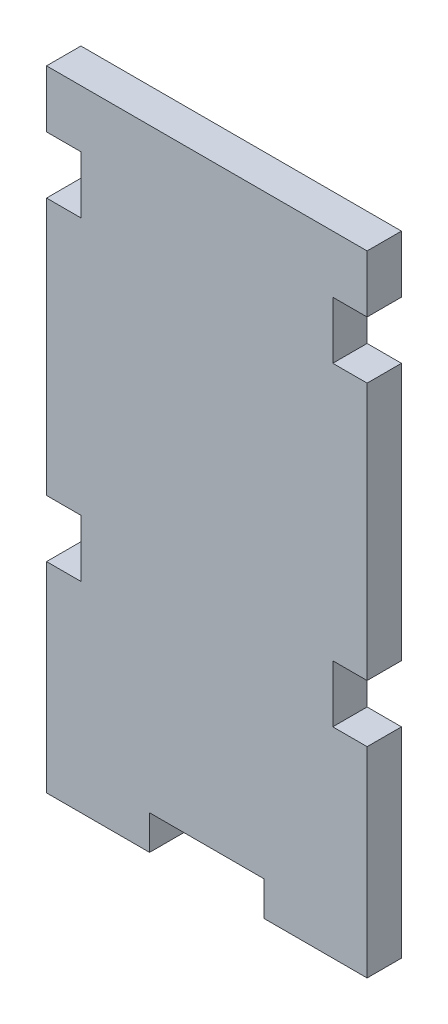
ISO-10303-21;
HEADER;
FILE_DESCRIPTION(('STEP AP214'),'2;1');
FILE_NAME('part.step','',(''),(''),'','','');
FILE_SCHEMA(('AUTOMOTIVE_DESIGN { 1 0 10303 214 1 1 1 1 }'));
ENDSEC;
DATA;
#1=APPLICATION_CONTEXT('core data for automotive mechanical design processes');
#2=APPLICATION_PROTOCOL_DEFINITION('international standard','automotive_design',2000,#1);
#3=PRODUCT_CONTEXT('',#1,'mechanical');
#4=PRODUCT('Part','Part','',(#3));
#5=PRODUCT_RELATED_PRODUCT_CATEGORY('part','',(#4));
#6=PRODUCT_DEFINITION_FORMATION('','',#4);
#7=PRODUCT_DEFINITION_CONTEXT('part definition',#1,'design');
#8=PRODUCT_DEFINITION('design','',#6,#7);
#9=PRODUCT_DEFINITION_SHAPE('','',#8);
#10=(LENGTH_UNIT() NAMED_UNIT(*) SI_UNIT(.MILLI.,.METRE.));
#11=(NAMED_UNIT(*) PLANE_ANGLE_UNIT() SI_UNIT($,.RADIAN.));
#12=(NAMED_UNIT(*) SI_UNIT($,.STERADIAN.) SOLID_ANGLE_UNIT());
#13=UNCERTAINTY_MEASURE_WITH_UNIT(LENGTH_MEASURE(1.E-05),#10,'distance_accuracy_value','');
#14=(GEOMETRIC_REPRESENTATION_CONTEXT(3) GLOBAL_UNCERTAINTY_ASSIGNED_CONTEXT((#13)) GLOBAL_UNIT_ASSIGNED_CONTEXT((#10,
#11,#12)) REPRESENTATION_CONTEXT('',''));
#15=CARTESIAN_POINT('',(0.,0.,0.));
#16=DIRECTION('',(0.,0.,1.));
#17=DIRECTION('',(1.,0.,0.));
#18=AXIS2_PLACEMENT_3D('',#15,#16,#17);
#19=CARTESIAN_POINT('',(0.,0.,6.));
#20=DIRECTION('',(0.,1.,0.));
#21=DIRECTION('',(0.,0.,1.));
#22=AXIS2_PLACEMENT_3D('',#19,#20,#21);
#23=PLANE('',#22);
#24=DIRECTION('',(1.,0.,0.));
#25=VECTOR('',#24,1.);
#26=CARTESIAN_POINT('',(0.,0.,6.));
#27=LINE('',#26,#25);
#28=CARTESIAN_POINT('',(32.,0.,6.));
#29=VERTEX_POINT('',#28);
#30=CARTESIAN_POINT('',(50.,0.,6.));
#31=VERTEX_POINT('',#30);
#32=EDGE_CURVE('E212',#29,#31,#27,.T.);
#33=ORIENTED_EDGE('',*,*,#32,.F.);
#34=DIRECTION('',(0.,0.,-1.));
#35=VECTOR('',#34,1.);
#36=CARTESIAN_POINT('',(32.,0.,6.));
#37=LINE('',#36,#35);
#38=CARTESIAN_POINT('',(32.,0.,0.));
#39=VERTEX_POINT('',#38);
#40=EDGE_CURVE('E197',#29,#39,#37,.T.);
#41=ORIENTED_EDGE('',*,*,#40,.T.);
#42=DIRECTION('',(1.,0.,0.));
#43=VECTOR('',#42,1.);
#44=CARTESIAN_POINT('',(0.,0.,0.));
#45=LINE('',#44,#43);
#46=CARTESIAN_POINT('',(50.,0.,0.));
#47=VERTEX_POINT('',#46);
#48=EDGE_CURVE('E335',#39,#47,#45,.T.);
#49=ORIENTED_EDGE('',*,*,#48,.T.);
#50=DIRECTION('',(0.,0.,1.));
#51=VECTOR('',#50,1.);
#52=CARTESIAN_POINT('',(50.,0.,0.));
#53=LINE('',#52,#51);
#54=EDGE_CURVE('E220',#47,#31,#53,.T.);
#55=ORIENTED_EDGE('',*,*,#54,.T.);
#56=EDGE_LOOP('',(#33,#41,#49,#55));
#57=FACE_BOUND('',#56,.T.);
#58=ADVANCED_FACE('F33',(#57),#23,.F.);
#59=CARTESIAN_POINT('',(44.,0.,6.));
#60=DIRECTION('',(-1.,0.,0.));
#61=DIRECTION('',(0.,-1.,0.));
#62=AXIS2_PLACEMENT_3D('',#59,#60,#61);
#63=PLANE('',#62);
#64=DIRECTION('',(0.,1.,0.));
#65=VECTOR('',#64,1.);
#66=CARTESIAN_POINT('',(44.,0.,0.));
#67=LINE('',#66,#65);
#68=CARTESIAN_POINT('',(44.,90.,0.));
#69=VERTEX_POINT('',#68);
#70=CARTESIAN_POINT('',(44.,100.,0.));
#71=VERTEX_POINT('',#70);
#72=EDGE_CURVE('E339',#69,#71,#67,.T.);
#73=ORIENTED_EDGE('',*,*,#72,.T.);
#74=DIRECTION('',(0.,0.,1.));
#75=VECTOR('',#74,1.);
#76=CARTESIAN_POINT('',(44.,100.,0.));
#77=LINE('',#76,#75);
#78=CARTESIAN_POINT('',(44.,100.,6.));
#79=VERTEX_POINT('',#78);
#80=EDGE_CURVE('E59',#71,#79,#77,.T.);
#81=ORIENTED_EDGE('',*,*,#80,.T.);
#82=DIRECTION('',(0.,1.,0.));
#83=VECTOR('',#82,1.);
#84=CARTESIAN_POINT('',(44.,0.,6.));
#85=LINE('',#84,#83);
#86=CARTESIAN_POINT('',(44.,90.,6.));
#87=VERTEX_POINT('',#86);
#88=EDGE_CURVE('E37',#87,#79,#85,.T.);
#89=ORIENTED_EDGE('',*,*,#88,.F.);
#90=DIRECTION('',(0.,0.,1.));
#91=VECTOR('',#90,1.);
#92=CARTESIAN_POINT('',(44.,90.,0.));
#93=LINE('',#92,#91);
#94=EDGE_CURVE('E360',#69,#87,#93,.T.);
#95=ORIENTED_EDGE('',*,*,#94,.F.);
#96=EDGE_LOOP('',(#73,#81,#89,#95));
#97=FACE_BOUND('',#96,.T.);
#98=ADVANCED_FACE('F445',(#97),#63,.F.);
#99=CARTESIAN_POINT('',(44.,35.,0.));
#100=VERTEX_POINT('',#99);
#101=CARTESIAN_POINT('',(44.,45.,0.));
#102=VERTEX_POINT('',#101);
#103=EDGE_CURVE('E239',#100,#102,#67,.T.);
#104=ORIENTED_EDGE('',*,*,#103,.T.);
#105=DIRECTION('',(0.,0.,1.));
#106=VECTOR('',#105,1.);
#107=CARTESIAN_POINT('',(44.,45.,0.));
#108=LINE('',#107,#106);
#109=CARTESIAN_POINT('',(44.,45.,6.));
#110=VERTEX_POINT('',#109);
#111=EDGE_CURVE('E353',#102,#110,#108,.T.);
#112=ORIENTED_EDGE('',*,*,#111,.T.);
#113=CARTESIAN_POINT('',(44.,35.,6.));
#114=VERTEX_POINT('',#113);
#115=EDGE_CURVE('E43',#114,#110,#85,.T.);
#116=ORIENTED_EDGE('',*,*,#115,.F.);
#117=DIRECTION('',(0.,0.,1.));
#118=VECTOR('',#117,1.);
#119=CARTESIAN_POINT('',(44.,35.,0.));
#120=LINE('',#119,#118);
#121=EDGE_CURVE('E242',#100,#114,#120,.T.);
#122=ORIENTED_EDGE('',*,*,#121,.F.);
#123=EDGE_LOOP('',(#104,#112,#116,#122));
#124=FACE_BOUND('',#123,.T.);
#125=ADVANCED_FACE('F423',(#124),#63,.F.);
#126=CARTESIAN_POINT('',(0.,0.,6.));
#127=DIRECTION('',(1.,0.,0.));
#128=DIRECTION('',(0.,1.,0.));
#129=AXIS2_PLACEMENT_3D('',#126,#127,#128);
#130=PLANE('',#129);
#131=DIRECTION('',(0.,-1.,0.));
#132=VECTOR('',#131,1.);
#133=CARTESIAN_POINT('',(0.,0.,0.));
#134=LINE('',#133,#132);
#135=CARTESIAN_POINT('',(0.,45.,0.));
#136=VERTEX_POINT('',#135);
#137=CARTESIAN_POINT('',(0.,35.,0.));
#138=VERTEX_POINT('',#137);
#139=EDGE_CURVE('E318',#136,#138,#134,.T.);
#140=ORIENTED_EDGE('',*,*,#139,.T.);
#141=DIRECTION('',(0.,0.,1.));
#142=VECTOR('',#141,1.);
#143=CARTESIAN_POINT('',(0.,35.,0.));
#144=LINE('',#143,#142);
#145=CARTESIAN_POINT('',(0.,35.,6.));
#146=VERTEX_POINT('',#145);
#147=EDGE_CURVE('E265',#138,#146,#144,.T.);
#148=ORIENTED_EDGE('',*,*,#147,.T.);
#149=DIRECTION('',(0.,-1.,0.));
#150=VECTOR('',#149,1.);
#151=CARTESIAN_POINT('',(0.,0.,6.));
#152=LINE('',#151,#150);
#153=CARTESIAN_POINT('',(0.,45.,6.));
#154=VERTEX_POINT('',#153);
#155=EDGE_CURVE('E227',#154,#146,#152,.T.);
#156=ORIENTED_EDGE('',*,*,#155,.F.);
#157=DIRECTION('',(0.,0.,1.));
#158=VECTOR('',#157,1.);
#159=CARTESIAN_POINT('',(0.,45.,0.));
#160=LINE('',#159,#158);
#161=EDGE_CURVE('E295',#136,#154,#160,.T.);
#162=ORIENTED_EDGE('',*,*,#161,.F.);
#163=EDGE_LOOP('',(#140,#148,#156,#162));
#164=FACE_BOUND('',#163,.T.);
#165=ADVANCED_FACE('F458',(#164),#130,.F.);
#166=CARTESIAN_POINT('',(0.,100.,0.));
#167=VERTEX_POINT('',#166);
#168=CARTESIAN_POINT('',(0.,90.,0.));
#169=VERTEX_POINT('',#168);
#170=EDGE_CURVE('E329',#167,#169,#134,.T.);
#171=ORIENTED_EDGE('',*,*,#170,.T.);
#172=DIRECTION('',(0.,0.,1.));
#173=VECTOR('',#172,1.);
#174=CARTESIAN_POINT('',(0.,90.,0.));
#175=LINE('',#174,#173);
#176=CARTESIAN_POINT('',(0.,90.,6.));
#177=VERTEX_POINT('',#176);
#178=EDGE_CURVE('E287',#169,#177,#175,.T.);
#179=ORIENTED_EDGE('',*,*,#178,.T.);
#180=CARTESIAN_POINT('',(0.,100.,6.));
#181=VERTEX_POINT('',#180);
#182=EDGE_CURVE('E223',#181,#177,#152,.T.);
#183=ORIENTED_EDGE('',*,*,#182,.F.);
#184=DIRECTION('',(0.,0.,1.));
#185=VECTOR('',#184,1.);
#186=CARTESIAN_POINT('',(0.,100.,0.));
#187=LINE('',#186,#185);
#188=EDGE_CURVE('E315',#167,#181,#187,.T.);
#189=ORIENTED_EDGE('',*,*,#188,.F.);
#190=EDGE_LOOP('',(#171,#179,#183,#189));
#191=FACE_BOUND('',#190,.T.);
#192=ADVANCED_FACE('F35',(#191),#130,.F.);
#193=CARTESIAN_POINT('',(-6.,0.,0.));
#194=VERTEX_POINT('',#193);
#195=CARTESIAN_POINT('',(12.,0.,0.));
#196=VERTEX_POINT('',#195);
#197=EDGE_CURVE('E332',#194,#196,#45,.T.);
#198=ORIENTED_EDGE('',*,*,#197,.T.);
#199=DIRECTION('',(0.,0.,-1.));
#200=VECTOR('',#199,1.);
#201=CARTESIAN_POINT('',(12.,0.,6.));
#202=LINE('',#201,#200);
#203=CARTESIAN_POINT('',(12.,0.,6.));
#204=VERTEX_POINT('',#203);
#205=EDGE_CURVE('E51',#204,#196,#202,.T.);
#206=ORIENTED_EDGE('',*,*,#205,.F.);
#207=CARTESIAN_POINT('',(-6.,0.,6.));
#208=VERTEX_POINT('',#207);
#209=EDGE_CURVE('E222',#208,#204,#27,.T.);
#210=ORIENTED_EDGE('',*,*,#209,.F.);
#211=DIRECTION('',(0.,0.,1.));
#212=VECTOR('',#211,1.);
#213=CARTESIAN_POINT('',(-6.,0.,0.));
#214=LINE('',#213,#212);
#215=EDGE_CURVE('E270',#194,#208,#214,.T.);
#216=ORIENTED_EDGE('',*,*,#215,.F.);
#217=EDGE_LOOP('',(#198,#206,#210,#216));
#218=FACE_BOUND('',#217,.T.);
#219=ADVANCED_FACE('F412',(#218),#23,.F.);
#220=CARTESIAN_POINT('',(0.,110.,6.));
#221=DIRECTION('',(0.,-1.,0.));
#222=DIRECTION('',(0.,0.,-1.));
#223=AXIS2_PLACEMENT_3D('',#220,#221,#222);
#224=PLANE('',#223);
#225=DIRECTION('',(-1.,0.,0.));
#226=VECTOR('',#225,1.);
#227=CARTESIAN_POINT('',(0.,110.,0.));
#228=LINE('',#227,#226);
#229=CARTESIAN_POINT('',(50.,110.,0.));
#230=VERTEX_POINT('',#229);
#231=CARTESIAN_POINT('',(-6.00000000000003,110.,0.));
#232=VERTEX_POINT('',#231);
#233=EDGE_CURVE('E336',#230,#232,#228,.T.);
#234=ORIENTED_EDGE('',*,*,#233,.T.);
#235=DIRECTION('',(0.,0.,1.));
#236=VECTOR('',#235,1.);
#237=CARTESIAN_POINT('',(-6.00000000000003,110.,0.));
#238=LINE('',#237,#236);
#239=CARTESIAN_POINT('',(-6.00000000000003,110.,6.));
#240=VERTEX_POINT('',#239);
#241=EDGE_CURVE('E326',#232,#240,#238,.T.);
#242=ORIENTED_EDGE('',*,*,#241,.T.);
#243=DIRECTION('',(-1.,0.,0.));
#244=VECTOR('',#243,1.);
#245=CARTESIAN_POINT('',(0.,110.,6.));
#246=LINE('',#245,#244);
#247=CARTESIAN_POINT('',(50.,110.,6.));
#248=VERTEX_POINT('',#247);
#249=EDGE_CURVE('E11',#248,#240,#246,.T.);
#250=ORIENTED_EDGE('',*,*,#249,.F.);
#251=DIRECTION('',(0.,0.,1.));
#252=VECTOR('',#251,1.);
#253=CARTESIAN_POINT('',(50.,110.,0.));
#254=LINE('',#253,#252);
#255=EDGE_CURVE('E373',#230,#248,#254,.T.);
#256=ORIENTED_EDGE('',*,*,#255,.F.);
#257=EDGE_LOOP('',(#234,#242,#250,#256));
#258=FACE_BOUND('',#257,.T.);
#259=ADVANCED_FACE('F451',(#258),#224,.F.);
#260=CARTESIAN_POINT('',(0.,0.,6.));
#261=DIRECTION('',(0.,0.,-1.));
#262=DIRECTION('',(-1.,0.,0.));
#263=AXIS2_PLACEMENT_3D('',#260,#261,#262);
#264=PLANE('',#263);
#265=DIRECTION('',(1.,0.,0.));
#266=VECTOR('',#265,1.);
#267=CARTESIAN_POINT('',(32.,6.,6.));
#268=LINE('',#267,#266);
#269=CARTESIAN_POINT('',(12.,6.,6.));
#270=VERTEX_POINT('',#269);
#271=CARTESIAN_POINT('',(32.,6.,6.));
#272=VERTEX_POINT('',#271);
#273=EDGE_CURVE('E207',#270,#272,#268,.T.);
#274=ORIENTED_EDGE('',*,*,#273,.T.);
#275=DIRECTION('',(0.,-1.,0.));
#276=VECTOR('',#275,1.);
#277=CARTESIAN_POINT('',(32.,0.,6.));
#278=LINE('',#277,#276);
#279=EDGE_CURVE('E200',#272,#29,#278,.T.);
#280=ORIENTED_EDGE('',*,*,#279,.T.);
#281=ORIENTED_EDGE('',*,*,#32,.T.);
#282=DIRECTION('',(0.,1.,0.));
#283=VECTOR('',#282,1.);
#284=CARTESIAN_POINT('',(50.,0.,6.));
#285=LINE('',#284,#283);
#286=CARTESIAN_POINT('',(50.,35.,6.));
#287=VERTEX_POINT('',#286);
#288=EDGE_CURVE('E253',#31,#287,#285,.T.);
#289=ORIENTED_EDGE('',*,*,#288,.T.);
#290=DIRECTION('',(-1.,0.,0.));
#291=VECTOR('',#290,1.);
#292=CARTESIAN_POINT('',(44.,35.,6.));
#293=LINE('',#292,#291);
#294=EDGE_CURVE('E248',#287,#114,#293,.T.);
#295=ORIENTED_EDGE('',*,*,#294,.T.);
#296=ORIENTED_EDGE('',*,*,#115,.T.);
#297=DIRECTION('',(1.,0.,0.));
#298=VECTOR('',#297,1.);
#299=CARTESIAN_POINT('',(44.,45.,6.));
#300=LINE('',#299,#298);
#301=CARTESIAN_POINT('',(50.,45.,6.));
#302=VERTEX_POINT('',#301);
#303=EDGE_CURVE('E370',#110,#302,#300,.T.);
#304=ORIENTED_EDGE('',*,*,#303,.T.);
#305=DIRECTION('',(0.,1.,0.));
#306=VECTOR('',#305,1.);
#307=CARTESIAN_POINT('',(50.,45.,6.));
#308=LINE('',#307,#306);
#309=CARTESIAN_POINT('',(50.,90.,6.));
#310=VERTEX_POINT('',#309);
#311=EDGE_CURVE('E367',#302,#310,#308,.T.);
#312=ORIENTED_EDGE('',*,*,#311,.T.);
#313=DIRECTION('',(-1.,0.,0.));
#314=VECTOR('',#313,1.);
#315=CARTESIAN_POINT('',(44.,90.,6.));
#316=LINE('',#315,#314);
#317=EDGE_CURVE('E363',#310,#87,#316,.T.);
#318=ORIENTED_EDGE('',*,*,#317,.T.);
#319=ORIENTED_EDGE('',*,*,#88,.T.);
#320=DIRECTION('',(1.,0.,0.));
#321=VECTOR('',#320,1.);
#322=CARTESIAN_POINT('',(44.,100.,6.));
#323=LINE('',#322,#321);
#324=CARTESIAN_POINT('',(50.,100.,6.));
#325=VERTEX_POINT('',#324);
#326=EDGE_CURVE('E391',#79,#325,#323,.T.);
#327=ORIENTED_EDGE('',*,*,#326,.T.);
#328=DIRECTION('',(0.,1.,0.));
#329=VECTOR('',#328,1.);
#330=CARTESIAN_POINT('',(50.,110.,6.));
#331=LINE('',#330,#329);
#332=EDGE_CURVE('E387',#325,#248,#331,.T.);
#333=ORIENTED_EDGE('',*,*,#332,.T.);
#334=ORIENTED_EDGE('',*,*,#249,.T.);
#335=DIRECTION('',(0.,-1.,0.));
#336=VECTOR('',#335,1.);
#337=CARTESIAN_POINT('',(-6.00000000000003,110.,6.));
#338=LINE('',#337,#336);
#339=CARTESIAN_POINT('',(-6.00000000000003,100.,6.));
#340=VERTEX_POINT('',#339);
#341=EDGE_CURVE('E298',#240,#340,#338,.T.);
#342=ORIENTED_EDGE('',*,*,#341,.T.);
#343=DIRECTION('',(1.,0.,0.));
#344=VECTOR('',#343,1.);
#345=CARTESIAN_POINT('',(0.,100.,6.));
#346=LINE('',#345,#344);
#347=EDGE_CURVE('E308',#340,#181,#346,.T.);
#348=ORIENTED_EDGE('',*,*,#347,.T.);
#349=ORIENTED_EDGE('',*,*,#182,.T.);
#350=DIRECTION('',(-1.,0.,0.));
#351=VECTOR('',#350,1.);
#352=CARTESIAN_POINT('',(0.,90.,6.));
#353=LINE('',#352,#351);
#354=CARTESIAN_POINT('',(-6.00000000000003,90.,6.));
#355=VERTEX_POINT('',#354);
#356=EDGE_CURVE('E273',#177,#355,#353,.T.);
#357=ORIENTED_EDGE('',*,*,#356,.T.);
#358=DIRECTION('',(0.,-1.,0.));
#359=VECTOR('',#358,1.);
#360=CARTESIAN_POINT('',(-6.00000000000003,90.,6.));
#361=LINE('',#360,#359);
#362=CARTESIAN_POINT('',(-6.00000000000002,45.,6.));
#363=VERTEX_POINT('',#362);
#364=EDGE_CURVE('E290',#355,#363,#361,.T.);
#365=ORIENTED_EDGE('',*,*,#364,.T.);
#366=DIRECTION('',(1.,0.,0.));
#367=VECTOR('',#366,1.);
#368=CARTESIAN_POINT('',(0.,45.,6.));
#369=LINE('',#368,#367);
#370=EDGE_CURVE('E281',#363,#154,#369,.T.);
#371=ORIENTED_EDGE('',*,*,#370,.T.);
#372=ORIENTED_EDGE('',*,*,#155,.T.);
#373=DIRECTION('',(-1.,0.,0.));
#374=VECTOR('',#373,1.);
#375=CARTESIAN_POINT('',(0.,35.,6.));
#376=LINE('',#375,#374);
#377=CARTESIAN_POINT('',(-6.,35.,6.));
#378=VERTEX_POINT('',#377);
#379=EDGE_CURVE('E246',#146,#378,#376,.T.);
#380=ORIENTED_EDGE('',*,*,#379,.T.);
#381=DIRECTION('',(0.,-1.,0.));
#382=VECTOR('',#381,1.);
#383=CARTESIAN_POINT('',(-6.,0.,6.));
#384=LINE('',#383,#382);
#385=EDGE_CURVE('E262',#378,#208,#384,.T.);
#386=ORIENTED_EDGE('',*,*,#385,.T.);
#387=ORIENTED_EDGE('',*,*,#209,.T.);
#388=DIRECTION('',(0.,1.,0.));
#389=VECTOR('',#388,1.);
#390=CARTESIAN_POINT('',(12.,0.,6.));
#391=LINE('',#390,#389);
#392=EDGE_CURVE('E216',#204,#270,#391,.T.);
#393=ORIENTED_EDGE('',*,*,#392,.T.);
#394=EDGE_LOOP('',(#274,#280,#281,#289,#295,#296,#304,#312,#318,#319,#327,#333,#334,#342,#348,
#349,#357,#365,#371,#372,#380,#386,#387,#393));
#395=FACE_BOUND('',#394,.T.);
#396=ADVANCED_FACE('F210',(#395),#264,.F.);
#397=CARTESIAN_POINT('',(0.,0.,0.));
#398=DIRECTION('',(0.,0.,-1.));
#399=DIRECTION('',(-1.,0.,0.));
#400=AXIS2_PLACEMENT_3D('',#397,#398,#399);
#401=PLANE('',#400);
#402=DIRECTION('',(0.,-1.,0.));
#403=VECTOR('',#402,1.);
#404=CARTESIAN_POINT('',(32.,0.,0.));
#405=LINE('',#404,#403);
#406=CARTESIAN_POINT('',(32.,6.,0.));
#407=VERTEX_POINT('',#406);
#408=EDGE_CURVE('E203',#407,#39,#405,.T.);
#409=ORIENTED_EDGE('',*,*,#408,.F.);
#410=DIRECTION('',(1.,0.,0.));
#411=VECTOR('',#410,1.);
#412=CARTESIAN_POINT('',(32.,6.,0.));
#413=LINE('',#412,#411);
#414=CARTESIAN_POINT('',(12.,6.,0.));
#415=VERTEX_POINT('',#414);
#416=EDGE_CURVE('E217',#415,#407,#413,.T.);
#417=ORIENTED_EDGE('',*,*,#416,.F.);
#418=DIRECTION('',(0.,1.,0.));
#419=VECTOR('',#418,1.);
#420=CARTESIAN_POINT('',(12.,0.,0.));
#421=LINE('',#420,#419);
#422=EDGE_CURVE('E405',#196,#415,#421,.T.);
#423=ORIENTED_EDGE('',*,*,#422,.F.);
#424=ORIENTED_EDGE('',*,*,#197,.F.);
#425=DIRECTION('',(0.,-1.,0.));
#426=VECTOR('',#425,1.);
#427=CARTESIAN_POINT('',(-6.,0.,0.));
#428=LINE('',#427,#426);
#429=CARTESIAN_POINT('',(-6.,35.,0.));
#430=VERTEX_POINT('',#429);
#431=EDGE_CURVE('E261',#430,#194,#428,.T.);
#432=ORIENTED_EDGE('',*,*,#431,.F.);
#433=DIRECTION('',(-1.,0.,0.));
#434=VECTOR('',#433,1.);
#435=CARTESIAN_POINT('',(0.,35.,0.));
#436=LINE('',#435,#434);
#437=EDGE_CURVE('E258',#138,#430,#436,.T.);
#438=ORIENTED_EDGE('',*,*,#437,.F.);
#439=ORIENTED_EDGE('',*,*,#139,.F.);
#440=DIRECTION('',(1.,0.,0.));
#441=VECTOR('',#440,1.);
#442=CARTESIAN_POINT('',(0.,45.,0.));
#443=LINE('',#442,#441);
#444=CARTESIAN_POINT('',(-6.00000000000002,45.,0.));
#445=VERTEX_POINT('',#444);
#446=EDGE_CURVE('E284',#445,#136,#443,.T.);
#447=ORIENTED_EDGE('',*,*,#446,.F.);
#448=DIRECTION('',(0.,-1.,0.));
#449=VECTOR('',#448,1.);
#450=CARTESIAN_POINT('',(-6.00000000000003,90.,0.));
#451=LINE('',#450,#449);
#452=CARTESIAN_POINT('',(-6.00000000000003,90.,0.));
#453=VERTEX_POINT('',#452);
#454=EDGE_CURVE('E280',#453,#445,#451,.T.);
#455=ORIENTED_EDGE('',*,*,#454,.F.);
#456=DIRECTION('',(-1.,0.,0.));
#457=VECTOR('',#456,1.);
#458=CARTESIAN_POINT('',(0.,90.,0.));
#459=LINE('',#458,#457);
#460=EDGE_CURVE('E277',#169,#453,#459,.T.);
#461=ORIENTED_EDGE('',*,*,#460,.F.);
#462=ORIENTED_EDGE('',*,*,#170,.F.);
#463=DIRECTION('',(1.,0.,0.));
#464=VECTOR('',#463,1.);
#465=CARTESIAN_POINT('',(0.,100.,0.));
#466=LINE('',#465,#464);
#467=CARTESIAN_POINT('',(-6.00000000000003,100.,0.));
#468=VERTEX_POINT('',#467);
#469=EDGE_CURVE('E307',#468,#167,#466,.T.);
#470=ORIENTED_EDGE('',*,*,#469,.F.);
#471=DIRECTION('',(0.,-1.,0.));
#472=VECTOR('',#471,1.);
#473=CARTESIAN_POINT('',(-6.00000000000003,110.,0.));
#474=LINE('',#473,#472);
#475=EDGE_CURVE('E304',#232,#468,#474,.T.);
#476=ORIENTED_EDGE('',*,*,#475,.F.);
#477=ORIENTED_EDGE('',*,*,#233,.F.);
#478=DIRECTION('',(0.,1.,0.));
#479=VECTOR('',#478,1.);
#480=CARTESIAN_POINT('',(50.,110.,0.));
#481=LINE('',#480,#479);
#482=CARTESIAN_POINT('',(50.,100.,0.));
#483=VERTEX_POINT('',#482);
#484=EDGE_CURVE('E383',#483,#230,#481,.T.);
#485=ORIENTED_EDGE('',*,*,#484,.F.);
#486=DIRECTION('',(1.,0.,0.));
#487=VECTOR('',#486,1.);
#488=CARTESIAN_POINT('',(44.,100.,0.));
#489=LINE('',#488,#487);
#490=EDGE_CURVE('E390',#71,#483,#489,.T.);
#491=ORIENTED_EDGE('',*,*,#490,.F.);
#492=ORIENTED_EDGE('',*,*,#72,.F.);
#493=DIRECTION('',(-1.,0.,0.));
#494=VECTOR('',#493,1.);
#495=CARTESIAN_POINT('',(44.,90.,0.));
#496=LINE('',#495,#494);
#497=CARTESIAN_POINT('',(50.,90.,0.));
#498=VERTEX_POINT('',#497);
#499=EDGE_CURVE('E356',#498,#69,#496,.T.);
#500=ORIENTED_EDGE('',*,*,#499,.F.);
#501=DIRECTION('',(0.,1.,0.));
#502=VECTOR('',#501,1.);
#503=CARTESIAN_POINT('',(50.,45.,0.));
#504=LINE('',#503,#502);
#505=CARTESIAN_POINT('',(50.,45.,0.));
#506=VERTEX_POINT('',#505);
#507=EDGE_CURVE('E376',#506,#498,#504,.T.);
#508=ORIENTED_EDGE('',*,*,#507,.F.);
#509=DIRECTION('',(1.,0.,0.));
#510=VECTOR('',#509,1.);
#511=CARTESIAN_POINT('',(44.,45.,0.));
#512=LINE('',#511,#510);
#513=EDGE_CURVE('E366',#102,#506,#512,.T.);
#514=ORIENTED_EDGE('',*,*,#513,.F.);
#515=ORIENTED_EDGE('',*,*,#103,.F.);
#516=DIRECTION('',(-1.,0.,0.));
#517=VECTOR('',#516,1.);
#518=CARTESIAN_POINT('',(44.,35.,0.));
#519=LINE('',#518,#517);
#520=CARTESIAN_POINT('',(50.,35.,0.));
#521=VERTEX_POINT('',#520);
#522=EDGE_CURVE('E257',#521,#100,#519,.T.);
#523=ORIENTED_EDGE('',*,*,#522,.F.);
#524=DIRECTION('',(0.,1.,0.));
#525=VECTOR('',#524,1.);
#526=CARTESIAN_POINT('',(50.,0.,0.));
#527=LINE('',#526,#525);
#528=EDGE_CURVE('E344',#47,#521,#527,.T.);
#529=ORIENTED_EDGE('',*,*,#528,.F.);
#530=ORIENTED_EDGE('',*,*,#48,.F.);
#531=EDGE_LOOP('',(#409,#417,#423,#424,#432,#438,#439,#447,#455,#461,#462,#470,#476,#477,#485,
#491,#492,#500,#508,#514,#515,#523,#529,#530));
#532=FACE_BOUND('',#531,.T.);
#533=ADVANCED_FACE('F417',(#532),#401,.T.);
#534=CARTESIAN_POINT('',(0.,100.,0.));
#535=DIRECTION('',(0.,-1.,0.));
#536=DIRECTION('',(0.,0.,-1.));
#537=AXIS2_PLACEMENT_3D('',#534,#535,#536);
#538=PLANE('',#537);
#539=ORIENTED_EDGE('',*,*,#347,.F.);
#540=DIRECTION('',(0.,0.,1.));
#541=VECTOR('',#540,1.);
#542=CARTESIAN_POINT('',(-6.00000000000003,100.,0.));
#543=LINE('',#542,#541);
#544=EDGE_CURVE('E313',#468,#340,#543,.T.);
#545=ORIENTED_EDGE('',*,*,#544,.F.);
#546=ORIENTED_EDGE('',*,*,#469,.T.);
#547=ORIENTED_EDGE('',*,*,#188,.T.);
#548=EDGE_LOOP('',(#539,#545,#546,#547));
#549=FACE_BOUND('',#548,.T.);
#550=ADVANCED_FACE('F479',(#549),#538,.T.);
#551=CARTESIAN_POINT('',(-6.00000000000003,110.,0.));
#552=DIRECTION('',(-1.,0.,0.));
#553=DIRECTION('',(0.,-1.,0.));
#554=AXIS2_PLACEMENT_3D('',#551,#552,#553);
#555=PLANE('',#554);
#556=ORIENTED_EDGE('',*,*,#341,.F.);
#557=ORIENTED_EDGE('',*,*,#241,.F.);
#558=ORIENTED_EDGE('',*,*,#475,.T.);
#559=ORIENTED_EDGE('',*,*,#544,.T.);
#560=EDGE_LOOP('',(#556,#557,#558,#559));
#561=FACE_BOUND('',#560,.T.);
#562=ADVANCED_FACE('F486',(#561),#555,.T.);
#563=CARTESIAN_POINT('',(0.,45.,0.));
#564=DIRECTION('',(0.,-1.,0.));
#565=DIRECTION('',(0.,0.,-1.));
#566=AXIS2_PLACEMENT_3D('',#563,#564,#565);
#567=PLANE('',#566);
#568=ORIENTED_EDGE('',*,*,#370,.F.);
#569=DIRECTION('',(0.,0.,1.));
#570=VECTOR('',#569,1.);
#571=CARTESIAN_POINT('',(-6.00000000000002,45.,0.));
#572=LINE('',#571,#570);
#573=EDGE_CURVE('E299',#445,#363,#572,.T.);
#574=ORIENTED_EDGE('',*,*,#573,.F.);
#575=ORIENTED_EDGE('',*,*,#446,.T.);
#576=ORIENTED_EDGE('',*,*,#161,.T.);
#577=EDGE_LOOP('',(#568,#574,#575,#576));
#578=FACE_BOUND('',#577,.T.);
#579=ADVANCED_FACE('F586',(#578),#567,.T.);
#580=CARTESIAN_POINT('',(-6.00000000000003,90.,0.));
#581=DIRECTION('',(-1.,0.,0.));
#582=DIRECTION('',(0.,-1.,0.));
#583=AXIS2_PLACEMENT_3D('',#580,#581,#582);
#584=PLANE('',#583);
#585=ORIENTED_EDGE('',*,*,#364,.F.);
#586=DIRECTION('',(0.,0.,1.));
#587=VECTOR('',#586,1.);
#588=CARTESIAN_POINT('',(-6.00000000000003,90.,0.));
#589=LINE('',#588,#587);
#590=EDGE_CURVE('E301',#453,#355,#589,.T.);
#591=ORIENTED_EDGE('',*,*,#590,.F.);
#592=ORIENTED_EDGE('',*,*,#454,.T.);
#593=ORIENTED_EDGE('',*,*,#573,.T.);
#594=EDGE_LOOP('',(#585,#591,#592,#593));
#595=FACE_BOUND('',#594,.T.);
#596=ADVANCED_FACE('F475',(#595),#584,.T.);
#597=CARTESIAN_POINT('',(0.,90.,0.));
#598=DIRECTION('',(0.,1.,0.));
#599=DIRECTION('',(0.,0.,1.));
#600=AXIS2_PLACEMENT_3D('',#597,#598,#599);
#601=PLANE('',#600);
#602=ORIENTED_EDGE('',*,*,#356,.F.);
#603=ORIENTED_EDGE('',*,*,#178,.F.);
#604=ORIENTED_EDGE('',*,*,#460,.T.);
#605=ORIENTED_EDGE('',*,*,#590,.T.);
#606=EDGE_LOOP('',(#602,#603,#604,#605));
#607=FACE_BOUND('',#606,.T.);
#608=ADVANCED_FACE('F470',(#607),#601,.T.);
#609=CARTESIAN_POINT('',(-6.,0.,0.));
#610=DIRECTION('',(-1.,0.,0.));
#611=DIRECTION('',(0.,0.,1.));
#612=AXIS2_PLACEMENT_3D('',#609,#610,#611);
#613=PLANE('',#612);
#614=ORIENTED_EDGE('',*,*,#385,.F.);
#615=DIRECTION('',(0.,0.,1.));
#616=VECTOR('',#615,1.);
#617=CARTESIAN_POINT('',(-6.,35.,0.));
#618=LINE('',#617,#616);
#619=EDGE_CURVE('E274',#430,#378,#618,.T.);
#620=ORIENTED_EDGE('',*,*,#619,.F.);
#621=ORIENTED_EDGE('',*,*,#431,.T.);
#622=ORIENTED_EDGE('',*,*,#215,.T.);
#623=EDGE_LOOP('',(#614,#620,#621,#622));
#624=FACE_BOUND('',#623,.T.);
#625=ADVANCED_FACE('F440',(#624),#613,.T.);
#626=CARTESIAN_POINT('',(0.,35.,0.));
#627=DIRECTION('',(0.,1.,0.));
#628=DIRECTION('',(0.,0.,1.));
#629=AXIS2_PLACEMENT_3D('',#626,#627,#628);
#630=PLANE('',#629);
#631=ORIENTED_EDGE('',*,*,#379,.F.);
#632=ORIENTED_EDGE('',*,*,#147,.F.);
#633=ORIENTED_EDGE('',*,*,#437,.T.);
#634=ORIENTED_EDGE('',*,*,#619,.T.);
#635=EDGE_LOOP('',(#631,#632,#633,#634));
#636=FACE_BOUND('',#635,.T.);
#637=ADVANCED_FACE('F432',(#636),#630,.T.);
#638=CARTESIAN_POINT('',(44.,35.,0.));
#639=DIRECTION('',(0.,1.,0.));
#640=DIRECTION('',(0.,0.,1.));
#641=AXIS2_PLACEMENT_3D('',#638,#639,#640);
#642=PLANE('',#641);
#643=ORIENTED_EDGE('',*,*,#294,.F.);
#644=DIRECTION('',(0.,0.,1.));
#645=VECTOR('',#644,1.);
#646=CARTESIAN_POINT('',(50.,35.,0.));
#647=LINE('',#646,#645);
#648=EDGE_CURVE('E247',#521,#287,#647,.T.);
#649=ORIENTED_EDGE('',*,*,#648,.F.);
#650=ORIENTED_EDGE('',*,*,#522,.T.);
#651=ORIENTED_EDGE('',*,*,#121,.T.);
#652=EDGE_LOOP('',(#643,#649,#650,#651));
#653=FACE_BOUND('',#652,.T.);
#654=ADVANCED_FACE('F430',(#653),#642,.T.);
#655=CARTESIAN_POINT('',(50.,0.,0.));
#656=DIRECTION('',(1.,0.,0.));
#657=DIRECTION('',(0.,0.,-1.));
#658=AXIS2_PLACEMENT_3D('',#655,#656,#657);
#659=PLANE('',#658);
#660=ORIENTED_EDGE('',*,*,#288,.F.);
#661=ORIENTED_EDGE('',*,*,#54,.F.);
#662=ORIENTED_EDGE('',*,*,#528,.T.);
#663=ORIENTED_EDGE('',*,*,#648,.T.);
#664=EDGE_LOOP('',(#660,#661,#662,#663));
#665=FACE_BOUND('',#664,.T.);
#666=ADVANCED_FACE('F416',(#665),#659,.T.);
#667=CARTESIAN_POINT('',(44.,90.,0.));
#668=DIRECTION('',(0.,1.,0.));
#669=DIRECTION('',(0.,0.,1.));
#670=AXIS2_PLACEMENT_3D('',#667,#668,#669);
#671=PLANE('',#670);
#672=ORIENTED_EDGE('',*,*,#317,.F.);
#673=DIRECTION('',(0.,0.,1.));
#674=VECTOR('',#673,1.);
#675=CARTESIAN_POINT('',(50.,90.,0.));
#676=LINE('',#675,#674);
#677=EDGE_CURVE('E358',#498,#310,#676,.T.);
#678=ORIENTED_EDGE('',*,*,#677,.F.);
#679=ORIENTED_EDGE('',*,*,#499,.T.);
#680=ORIENTED_EDGE('',*,*,#94,.T.);
#681=EDGE_LOOP('',(#672,#678,#679,#680));
#682=FACE_BOUND('',#681,.T.);
#683=ADVANCED_FACE('F438',(#682),#671,.T.);
#684=CARTESIAN_POINT('',(50.,45.,0.));
#685=DIRECTION('',(1.,0.,0.));
#686=DIRECTION('',(0.,0.,-1.));
#687=AXIS2_PLACEMENT_3D('',#684,#685,#686);
#688=PLANE('',#687);
#689=ORIENTED_EDGE('',*,*,#311,.F.);
#690=DIRECTION('',(0.,0.,1.));
#691=VECTOR('',#690,1.);
#692=CARTESIAN_POINT('',(50.,45.,0.));
#693=LINE('',#692,#691);
#694=EDGE_CURVE('E355',#506,#302,#693,.T.);
#695=ORIENTED_EDGE('',*,*,#694,.F.);
#696=ORIENTED_EDGE('',*,*,#507,.T.);
#697=ORIENTED_EDGE('',*,*,#677,.T.);
#698=EDGE_LOOP('',(#689,#695,#696,#697));
#699=FACE_BOUND('',#698,.T.);
#700=ADVANCED_FACE('F499',(#699),#688,.T.);
#701=CARTESIAN_POINT('',(44.,45.,0.));
#702=DIRECTION('',(0.,-1.,0.));
#703=DIRECTION('',(0.,0.,-1.));
#704=AXIS2_PLACEMENT_3D('',#701,#702,#703);
#705=PLANE('',#704);
#706=ORIENTED_EDGE('',*,*,#303,.F.);
#707=ORIENTED_EDGE('',*,*,#111,.F.);
#708=ORIENTED_EDGE('',*,*,#513,.T.);
#709=ORIENTED_EDGE('',*,*,#694,.T.);
#710=EDGE_LOOP('',(#706,#707,#708,#709));
#711=FACE_BOUND('',#710,.T.);
#712=ADVANCED_FACE('F426',(#711),#705,.T.);
#713=CARTESIAN_POINT('',(50.,110.,0.));
#714=DIRECTION('',(1.,0.,0.));
#715=DIRECTION('',(0.,0.,-1.));
#716=AXIS2_PLACEMENT_3D('',#713,#714,#715);
#717=PLANE('',#716);
#718=ORIENTED_EDGE('',*,*,#332,.F.);
#719=DIRECTION('',(0.,0.,1.));
#720=VECTOR('',#719,1.);
#721=CARTESIAN_POINT('',(50.,100.,0.));
#722=LINE('',#721,#720);
#723=EDGE_CURVE('E382',#483,#325,#722,.T.);
#724=ORIENTED_EDGE('',*,*,#723,.F.);
#725=ORIENTED_EDGE('',*,*,#484,.T.);
#726=ORIENTED_EDGE('',*,*,#255,.T.);
#727=EDGE_LOOP('',(#718,#724,#725,#726));
#728=FACE_BOUND('',#727,.T.);
#729=ADVANCED_FACE('F490',(#728),#717,.T.);
#730=CARTESIAN_POINT('',(44.,100.,0.));
#731=DIRECTION('',(0.,-1.,0.));
#732=DIRECTION('',(0.,0.,-1.));
#733=AXIS2_PLACEMENT_3D('',#730,#731,#732);
#734=PLANE('',#733);
#735=ORIENTED_EDGE('',*,*,#326,.F.);
#736=ORIENTED_EDGE('',*,*,#80,.F.);
#737=ORIENTED_EDGE('',*,*,#490,.T.);
#738=ORIENTED_EDGE('',*,*,#723,.T.);
#739=EDGE_LOOP('',(#735,#736,#737,#738));
#740=FACE_BOUND('',#739,.T.);
#741=ADVANCED_FACE('F494',(#740),#734,.T.);
#742=CARTESIAN_POINT('',(32.,0.,6.));
#743=DIRECTION('',(1.,0.,0.));
#744=DIRECTION('',(0.,0.,-1.));
#745=AXIS2_PLACEMENT_3D('',#742,#743,#744);
#746=PLANE('',#745);
#747=ORIENTED_EDGE('',*,*,#408,.T.);
#748=ORIENTED_EDGE('',*,*,#40,.F.);
#749=ORIENTED_EDGE('',*,*,#279,.F.);
#750=DIRECTION('',(0.,0.,-1.));
#751=VECTOR('',#750,1.);
#752=CARTESIAN_POINT('',(32.,6.,6.));
#753=LINE('',#752,#751);
#754=EDGE_CURVE('E394',#272,#407,#753,.T.);
#755=ORIENTED_EDGE('',*,*,#754,.T.);
#756=EDGE_LOOP('',(#747,#748,#749,#755));
#757=FACE_BOUND('',#756,.T.);
#758=ADVANCED_FACE('F199',(#757),#746,.F.);
#759=CARTESIAN_POINT('',(32.,6.,6.));
#760=DIRECTION('',(0.,1.,0.));
#761=DIRECTION('',(0.,0.,1.));
#762=AXIS2_PLACEMENT_3D('',#759,#760,#761);
#763=PLANE('',#762);
#764=ORIENTED_EDGE('',*,*,#416,.T.);
#765=ORIENTED_EDGE('',*,*,#754,.F.);
#766=ORIENTED_EDGE('',*,*,#273,.F.);
#767=DIRECTION('',(0.,0.,-1.));
#768=VECTOR('',#767,1.);
#769=CARTESIAN_POINT('',(12.,6.,6.));
#770=LINE('',#769,#768);
#771=EDGE_CURVE('E400',#270,#415,#770,.T.);
#772=ORIENTED_EDGE('',*,*,#771,.T.);
#773=EDGE_LOOP('',(#764,#765,#766,#772));
#774=FACE_BOUND('',#773,.T.);
#775=ADVANCED_FACE('F514',(#774),#763,.F.);
#776=CARTESIAN_POINT('',(12.,0.,6.));
#777=DIRECTION('',(-1.,0.,0.));
#778=DIRECTION('',(0.,0.,1.));
#779=AXIS2_PLACEMENT_3D('',#776,#777,#778);
#780=PLANE('',#779);
#781=ORIENTED_EDGE('',*,*,#422,.T.);
#782=ORIENTED_EDGE('',*,*,#771,.F.);
#783=ORIENTED_EDGE('',*,*,#392,.F.);
#784=ORIENTED_EDGE('',*,*,#205,.T.);
#785=EDGE_LOOP('',(#781,#782,#783,#784));
#786=FACE_BOUND('',#785,.T.);
#787=ADVANCED_FACE('F409',(#786),#780,.F.);
#788=CLOSED_SHELL('',(#58,#98,#125,#165,#192,#219,#259,#396,#533,#550,#562,#579,#596,#608,#625,
#637,#654,#666,#683,#700,#712,#729,#741,#758,#775,#787));
#789=MANIFOLD_SOLID_BREP('B2',#788);
#790=ADVANCED_BREP_SHAPE_REPRESENTATION('',(#18,#789),#14);
#791=SHAPE_DEFINITION_REPRESENTATION(#9,#790);
ENDSEC;
END-ISO-10303-21;
